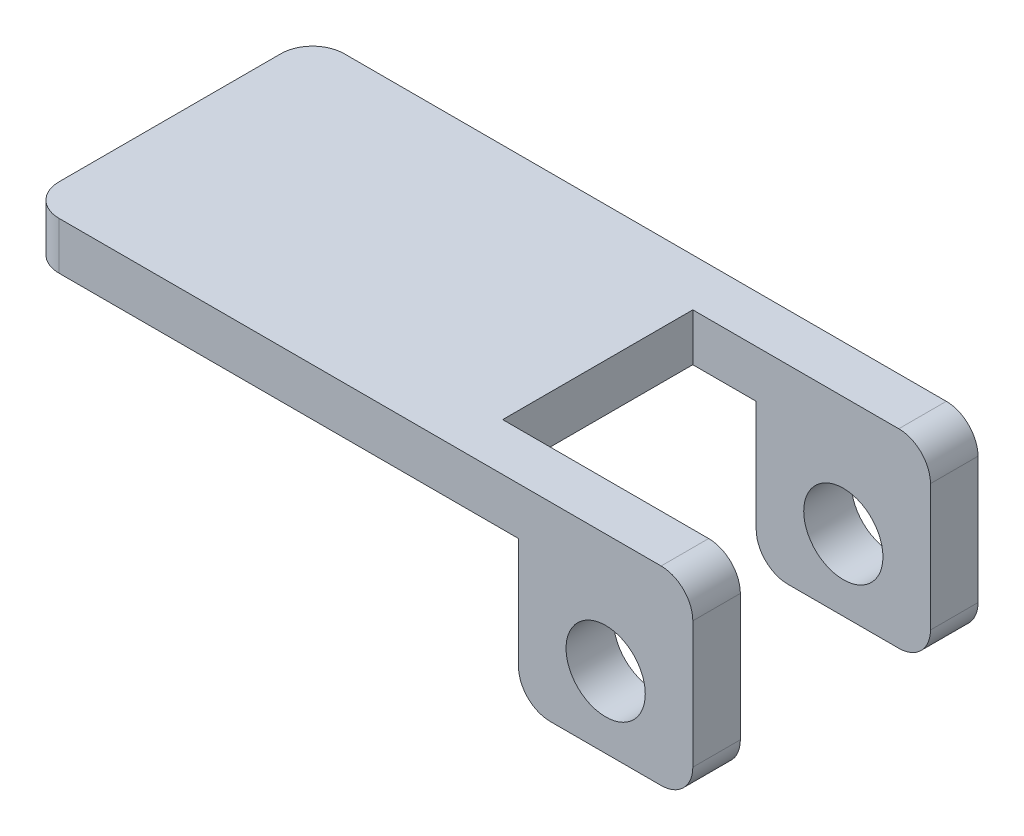
ISO-10303-21;
HEADER;
FILE_DESCRIPTION(('STEP AP214'),'2;1');
FILE_NAME('part.step','',(''),(''),'','','');
FILE_SCHEMA(('AUTOMOTIVE_DESIGN { 1 0 10303 214 1 1 1 1 }'));
ENDSEC;
DATA;
#1=APPLICATION_CONTEXT('core data for automotive mechanical design processes');
#2=APPLICATION_PROTOCOL_DEFINITION('international standard','automotive_design',2000,#1);
#3=PRODUCT_CONTEXT('',#1,'mechanical');
#4=PRODUCT('Part','Part','',(#3));
#5=PRODUCT_RELATED_PRODUCT_CATEGORY('part','',(#4));
#6=PRODUCT_DEFINITION_FORMATION('','',#4);
#7=PRODUCT_DEFINITION_CONTEXT('part definition',#1,'design');
#8=PRODUCT_DEFINITION('design','',#6,#7);
#9=PRODUCT_DEFINITION_SHAPE('','',#8);
#10=(LENGTH_UNIT() NAMED_UNIT(*) SI_UNIT(.MILLI.,.METRE.));
#11=(NAMED_UNIT(*) PLANE_ANGLE_UNIT() SI_UNIT($,.RADIAN.));
#12=(NAMED_UNIT(*) SI_UNIT($,.STERADIAN.) SOLID_ANGLE_UNIT());
#13=UNCERTAINTY_MEASURE_WITH_UNIT(LENGTH_MEASURE(1.E-05),#10,'distance_accuracy_value','');
#14=(GEOMETRIC_REPRESENTATION_CONTEXT(3) GLOBAL_UNCERTAINTY_ASSIGNED_CONTEXT((#13)) GLOBAL_UNIT_ASSIGNED_CONTEXT((#10,
#11,#12)) REPRESENTATION_CONTEXT('',''));
#15=CARTESIAN_POINT('',(0.,0.,0.));
#16=DIRECTION('',(0.,0.,1.));
#17=DIRECTION('',(1.,0.,0.));
#18=AXIS2_PLACEMENT_3D('',#15,#16,#17);
#19=CARTESIAN_POINT('',(42.,3.,0.));
#20=DIRECTION('',(-1.,0.,0.));
#21=DIRECTION('',(0.,0.,1.));
#22=AXIS2_PLACEMENT_3D('',#19,#20,#21);
#23=PLANE('',#22);
#24=DIRECTION('',(0.,1.,0.));
#25=VECTOR('',#24,1.);
#26=CARTESIAN_POINT('',(42.,-9.,-3.));
#27=LINE('',#26,#25);
#28=CARTESIAN_POINT('',(42.,-7.,-3.));
#29=VERTEX_POINT('',#28);
#30=CARTESIAN_POINT('',(42.,0.999999999999999,-3.));
#31=VERTEX_POINT('',#30);
#32=EDGE_CURVE('E245',#29,#31,#27,.T.);
#33=ORIENTED_EDGE('',*,*,#32,.T.);
#34=DIRECTION('',(0.,0.,-1.));
#35=VECTOR('',#34,1.);
#36=CARTESIAN_POINT('',(42.,1.,0.));
#37=LINE('',#36,#35);
#38=CARTESIAN_POINT('',(42.,1.,0.));
#39=VERTEX_POINT('',#38);
#40=EDGE_CURVE('E328',#31,#39,#37,.F.);
#41=ORIENTED_EDGE('',*,*,#40,.T.);
#42=DIRECTION('',(0.,-1.,0.));
#43=VECTOR('',#42,1.);
#44=CARTESIAN_POINT('',(42.,3.,0.));
#45=LINE('',#44,#43);
#46=CARTESIAN_POINT('',(42.,-7.,0.));
#47=VERTEX_POINT('',#46);
#48=EDGE_CURVE('E274',#39,#47,#45,.T.);
#49=ORIENTED_EDGE('',*,*,#48,.T.);
#50=DIRECTION('',(0.,0.,1.));
#51=VECTOR('',#50,1.);
#52=CARTESIAN_POINT('',(42.,-7.,0.));
#53=LINE('',#52,#51);
#54=EDGE_CURVE('E326',#47,#29,#53,.F.);
#55=ORIENTED_EDGE('',*,*,#54,.T.);
#56=EDGE_LOOP('',(#33,#41,#49,#55));
#57=FACE_BOUND('',#56,.T.);
#58=ADVANCED_FACE('F39',(#57),#23,.F.);
#59=CARTESIAN_POINT('',(0.,0.,0.));
#60=DIRECTION('',(0.,-1.,0.));
#61=DIRECTION('',(0.,0.,-1.));
#62=AXIS2_PLACEMENT_3D('',#59,#60,#61);
#63=PLANE('',#62);
#64=DIRECTION('',(0.,0.,1.));
#65=VECTOR('',#64,1.);
#66=CARTESIAN_POINT('',(0.,0.,0.));
#67=LINE('',#66,#65);
#68=CARTESIAN_POINT('',(0.,0.,-16.));
#69=VERTEX_POINT('',#68);
#70=CARTESIAN_POINT('',(0.,0.,-2.));
#71=VERTEX_POINT('',#70);
#72=EDGE_CURVE('E254',#69,#71,#67,.T.);
#73=ORIENTED_EDGE('',*,*,#72,.F.);
#74=CARTESIAN_POINT('',(2.,0.,-16.));
#75=DIRECTION('',(0.,-1.,0.));
#76=DIRECTION('',(0.,0.,-1.));
#77=AXIS2_PLACEMENT_3D('',#74,#75,#76);
#78=CIRCLE('',#77,2.);
#79=CARTESIAN_POINT('',(2.,0.,-18.));
#80=VERTEX_POINT('',#79);
#81=EDGE_CURVE('E286',#69,#80,#78,.T.);
#82=ORIENTED_EDGE('',*,*,#81,.T.);
#83=DIRECTION('',(-1.,0.,0.));
#84=VECTOR('',#83,1.);
#85=CARTESIAN_POINT('',(0.,0.,-18.));
#86=LINE('',#85,#84);
#87=CARTESIAN_POINT('',(31.,0.,-18.));
#88=VERTEX_POINT('',#87);
#89=EDGE_CURVE('E259',#88,#80,#86,.T.);
#90=ORIENTED_EDGE('',*,*,#89,.F.);
#91=DIRECTION('',(0.,0.,-1.));
#92=VECTOR('',#91,1.);
#93=CARTESIAN_POINT('',(31.,0.,-18.));
#94=LINE('',#93,#92);
#95=CARTESIAN_POINT('',(31.,0.,-15.));
#96=VERTEX_POINT('',#95);
#97=EDGE_CURVE('E205',#96,#88,#94,.T.);
#98=ORIENTED_EDGE('',*,*,#97,.F.);
#99=DIRECTION('',(-1.,0.,0.));
#100=VECTOR('',#99,1.);
#101=CARTESIAN_POINT('',(42.,0.,-15.));
#102=LINE('',#101,#100);
#103=CARTESIAN_POINT('',(27.,0.,-15.));
#104=VERTEX_POINT('',#103);
#105=EDGE_CURVE('E184',#96,#104,#102,.T.);
#106=ORIENTED_EDGE('',*,*,#105,.T.);
#107=DIRECTION('',(0.,0.,1.));
#108=VECTOR('',#107,1.);
#109=CARTESIAN_POINT('',(27.,0.,-15.));
#110=LINE('',#109,#108);
#111=CARTESIAN_POINT('',(27.,0.,-3.));
#112=VERTEX_POINT('',#111);
#113=EDGE_CURVE('E195',#104,#112,#110,.T.);
#114=ORIENTED_EDGE('',*,*,#113,.T.);
#115=DIRECTION('',(1.,0.,0.));
#116=VECTOR('',#115,1.);
#117=CARTESIAN_POINT('',(42.,0.,-3.));
#118=LINE('',#117,#116);
#119=CARTESIAN_POINT('',(31.,0.,-3.));
#120=VERTEX_POINT('',#119);
#121=EDGE_CURVE('E192',#112,#120,#118,.T.);
#122=ORIENTED_EDGE('',*,*,#121,.T.);
#123=DIRECTION('',(0.,0.,-1.));
#124=VECTOR('',#123,1.);
#125=CARTESIAN_POINT('',(31.,0.,0.));
#126=LINE('',#125,#124);
#127=CARTESIAN_POINT('',(31.,0.,0.));
#128=VERTEX_POINT('',#127);
#129=EDGE_CURVE('E239',#128,#120,#126,.T.);
#130=ORIENTED_EDGE('',*,*,#129,.F.);
#131=DIRECTION('',(1.,0.,0.));
#132=VECTOR('',#131,1.);
#133=CARTESIAN_POINT('',(0.,0.,0.));
#134=LINE('',#133,#132);
#135=CARTESIAN_POINT('',(2.,0.,0.));
#136=VERTEX_POINT('',#135);
#137=EDGE_CURVE('E267',#136,#128,#134,.T.);
#138=ORIENTED_EDGE('',*,*,#137,.F.);
#139=CARTESIAN_POINT('',(2.,0.,-2.));
#140=DIRECTION('',(0.,-1.,0.));
#141=DIRECTION('',(0.,0.,-1.));
#142=AXIS2_PLACEMENT_3D('',#139,#140,#141);
#143=CIRCLE('',#142,2.);
#144=EDGE_CURVE('E284',#136,#71,#143,.T.);
#145=ORIENTED_EDGE('',*,*,#144,.T.);
#146=EDGE_LOOP('',(#73,#82,#90,#98,#106,#114,#122,#130,#138,#145));
#147=FACE_BOUND('',#146,.T.);
#148=ADVANCED_FACE('F202',(#147),#63,.T.);
#149=CARTESIAN_POINT('',(0.,3.,0.));
#150=DIRECTION('',(1.,0.,0.));
#151=DIRECTION('',(0.,0.,-1.));
#152=AXIS2_PLACEMENT_3D('',#149,#150,#151);
#153=PLANE('',#152);
#154=DIRECTION('',(0.,0.,1.));
#155=VECTOR('',#154,1.);
#156=CARTESIAN_POINT('',(0.,3.,0.));
#157=LINE('',#156,#155);
#158=CARTESIAN_POINT('',(0.,3.,-16.));
#159=VERTEX_POINT('',#158);
#160=CARTESIAN_POINT('',(0.,3.,-2.));
#161=VERTEX_POINT('',#160);
#162=EDGE_CURVE('E255',#159,#161,#157,.T.);
#163=ORIENTED_EDGE('',*,*,#162,.F.);
#164=DIRECTION('',(0.,-1.,0.));
#165=VECTOR('',#164,1.);
#166=CARTESIAN_POINT('',(0.,3.,-16.));
#167=LINE('',#166,#165);
#168=EDGE_CURVE('E281',#159,#69,#167,.T.);
#169=ORIENTED_EDGE('',*,*,#168,.T.);
#170=ORIENTED_EDGE('',*,*,#72,.T.);
#171=DIRECTION('',(0.,-1.,0.));
#172=VECTOR('',#171,1.);
#173=CARTESIAN_POINT('',(0.,3.,-2.));
#174=LINE('',#173,#172);
#175=EDGE_CURVE('E277',#71,#161,#174,.F.);
#176=ORIENTED_EDGE('',*,*,#175,.T.);
#177=EDGE_LOOP('',(#163,#169,#170,#176));
#178=FACE_BOUND('',#177,.T.);
#179=ADVANCED_FACE('F394',(#178),#153,.F.);
#180=CARTESIAN_POINT('',(0.,3.,0.));
#181=DIRECTION('',(0.,0.,-1.));
#182=DIRECTION('',(-1.,0.,0.));
#183=AXIS2_PLACEMENT_3D('',#180,#181,#182);
#184=PLANE('',#183);
#185=CARTESIAN_POINT('',(36.5,-4.5,0.));
#186=DIRECTION('',(0.,0.,1.));
#187=DIRECTION('',(1.,0.,0.));
#188=AXIS2_PLACEMENT_3D('',#185,#186,#187);
#189=CIRCLE('',#188,2.5);
#190=CARTESIAN_POINT('',(39.,-4.5,0.));
#191=VERTEX_POINT('',#190);
#192=EDGE_CURVE('E215',#191,#191,#189,.T.);
#193=ORIENTED_EDGE('',*,*,#192,.F.);
#194=EDGE_LOOP('',(#193));
#195=FACE_BOUND('',#194,.T.);
#196=ORIENTED_EDGE('',*,*,#48,.F.);
#197=CARTESIAN_POINT('',(40.,1.,0.));
#198=DIRECTION('',(0.,0.,-1.));
#199=DIRECTION('',(-1.,0.,0.));
#200=AXIS2_PLACEMENT_3D('',#197,#198,#199);
#201=CIRCLE('',#200,2.);
#202=CARTESIAN_POINT('',(40.,3.,0.));
#203=VERTEX_POINT('',#202);
#204=EDGE_CURVE('E332',#39,#203,#201,.F.);
#205=ORIENTED_EDGE('',*,*,#204,.T.);
#206=DIRECTION('',(1.,0.,0.));
#207=VECTOR('',#206,1.);
#208=CARTESIAN_POINT('',(0.,3.,0.));
#209=LINE('',#208,#207);
#210=CARTESIAN_POINT('',(2.,3.,0.));
#211=VERTEX_POINT('',#210);
#212=EDGE_CURVE('E258',#211,#203,#209,.T.);
#213=ORIENTED_EDGE('',*,*,#212,.F.);
#214=DIRECTION('',(0.,-1.,0.));
#215=VECTOR('',#214,1.);
#216=CARTESIAN_POINT('',(2.,3.,0.));
#217=LINE('',#216,#215);
#218=EDGE_CURVE('E295',#211,#136,#217,.T.);
#219=ORIENTED_EDGE('',*,*,#218,.T.);
#220=ORIENTED_EDGE('',*,*,#137,.T.);
#221=DIRECTION('',(0.,1.,0.));
#222=VECTOR('',#221,1.);
#223=CARTESIAN_POINT('',(31.,-9.,0.));
#224=LINE('',#223,#222);
#225=CARTESIAN_POINT('',(31.,-7.,0.));
#226=VERTEX_POINT('',#225);
#227=EDGE_CURVE('E252',#226,#128,#224,.T.);
#228=ORIENTED_EDGE('',*,*,#227,.F.);
#229=CARTESIAN_POINT('',(33.,-7.,0.));
#230=DIRECTION('',(0.,0.,-1.));
#231=DIRECTION('',(-1.,0.,0.));
#232=AXIS2_PLACEMENT_3D('',#229,#230,#231);
#233=CIRCLE('',#232,2.);
#234=CARTESIAN_POINT('',(33.,-9.,0.));
#235=VERTEX_POINT('',#234);
#236=EDGE_CURVE('E54',#226,#235,#233,.F.);
#237=ORIENTED_EDGE('',*,*,#236,.T.);
#238=DIRECTION('',(-1.,0.,0.));
#239=VECTOR('',#238,1.);
#240=CARTESIAN_POINT('',(42.,-9.,0.));
#241=LINE('',#240,#239);
#242=CARTESIAN_POINT('',(40.,-9.,0.));
#243=VERTEX_POINT('',#242);
#244=EDGE_CURVE('E240',#243,#235,#241,.T.);
#245=ORIENTED_EDGE('',*,*,#244,.F.);
#246=CARTESIAN_POINT('',(40.,-7.,0.));
#247=DIRECTION('',(0.,0.,-1.));
#248=DIRECTION('',(-1.,0.,0.));
#249=AXIS2_PLACEMENT_3D('',#246,#247,#248);
#250=CIRCLE('',#249,2.);
#251=EDGE_CURVE('E62',#243,#47,#250,.F.);
#252=ORIENTED_EDGE('',*,*,#251,.T.);
#253=EDGE_LOOP('',(#196,#205,#213,#219,#220,#228,#237,#245,#252));
#254=FACE_BOUND('',#253,.T.);
#255=ADVANCED_FACE('F387',(#195,#254),#184,.F.);
#256=DIRECTION('',(0.,-1.,0.));
#257=VECTOR('',#256,1.);
#258=CARTESIAN_POINT('',(42.,3.,-18.));
#259=LINE('',#258,#257);
#260=CARTESIAN_POINT('',(42.,1.,-18.));
#261=VERTEX_POINT('',#260);
#262=CARTESIAN_POINT('',(42.,-7.,-18.));
#263=VERTEX_POINT('',#262);
#264=EDGE_CURVE('E264',#261,#263,#259,.T.);
#265=ORIENTED_EDGE('',*,*,#264,.F.);
#266=DIRECTION('',(0.,0.,-1.));
#267=VECTOR('',#266,1.);
#268=CARTESIAN_POINT('',(42.,1.,0.));
#269=LINE('',#268,#267);
#270=CARTESIAN_POINT('',(42.,0.999999999999999,-15.));
#271=VERTEX_POINT('',#270);
#272=EDGE_CURVE('E312',#261,#271,#269,.F.);
#273=ORIENTED_EDGE('',*,*,#272,.T.);
#274=DIRECTION('',(0.,1.,0.));
#275=VECTOR('',#274,1.);
#276=CARTESIAN_POINT('',(42.,-9.,-15.));
#277=LINE('',#276,#275);
#278=CARTESIAN_POINT('',(42.,-7.,-15.));
#279=VERTEX_POINT('',#278);
#280=EDGE_CURVE('E237',#279,#271,#277,.T.);
#281=ORIENTED_EDGE('',*,*,#280,.F.);
#282=DIRECTION('',(0.,0.,1.));
#283=VECTOR('',#282,1.);
#284=CARTESIAN_POINT('',(42.,-7.,-18.));
#285=LINE('',#284,#283);
#286=EDGE_CURVE('E310',#279,#263,#285,.F.);
#287=ORIENTED_EDGE('',*,*,#286,.T.);
#288=EDGE_LOOP('',(#265,#273,#281,#287));
#289=FACE_BOUND('',#288,.T.);
#290=ADVANCED_FACE('F368',(#289),#23,.F.);
#291=CARTESIAN_POINT('',(0.,3.,-18.));
#292=DIRECTION('',(0.,0.,1.));
#293=DIRECTION('',(1.,0.,0.));
#294=AXIS2_PLACEMENT_3D('',#291,#292,#293);
#295=PLANE('',#294);
#296=CARTESIAN_POINT('',(36.5,-4.5,-18.));
#297=DIRECTION('',(0.,0.,1.));
#298=DIRECTION('',(1.,0.,0.));
#299=AXIS2_PLACEMENT_3D('',#296,#297,#298);
#300=CIRCLE('',#299,2.5);
#301=CARTESIAN_POINT('',(39.,-4.5,-18.));
#302=VERTEX_POINT('',#301);
#303=EDGE_CURVE('E217',#302,#302,#300,.T.);
#304=ORIENTED_EDGE('',*,*,#303,.T.);
#305=EDGE_LOOP('',(#304));
#306=FACE_BOUND('',#305,.T.);
#307=DIRECTION('',(-1.,0.,0.));
#308=VECTOR('',#307,1.);
#309=CARTESIAN_POINT('',(0.,3.,-18.));
#310=LINE('',#309,#308);
#311=CARTESIAN_POINT('',(40.,3.,-18.));
#312=VERTEX_POINT('',#311);
#313=CARTESIAN_POINT('',(2.,3.,-18.));
#314=VERTEX_POINT('',#313);
#315=EDGE_CURVE('E262',#312,#314,#310,.T.);
#316=ORIENTED_EDGE('',*,*,#315,.F.);
#317=CARTESIAN_POINT('',(40.,1.,-18.));
#318=DIRECTION('',(0.,0.,1.));
#319=DIRECTION('',(1.,0.,0.));
#320=AXIS2_PLACEMENT_3D('',#317,#318,#319);
#321=CIRCLE('',#320,2.);
#322=EDGE_CURVE('E308',#312,#261,#321,.F.);
#323=ORIENTED_EDGE('',*,*,#322,.T.);
#324=ORIENTED_EDGE('',*,*,#264,.T.);
#325=CARTESIAN_POINT('',(40.,-7.,-18.));
#326=DIRECTION('',(0.,0.,1.));
#327=DIRECTION('',(1.,0.,0.));
#328=AXIS2_PLACEMENT_3D('',#325,#326,#327);
#329=CIRCLE('',#328,2.);
#330=CARTESIAN_POINT('',(40.,-9.,-18.));
#331=VERTEX_POINT('',#330);
#332=EDGE_CURVE('E306',#263,#331,#329,.F.);
#333=ORIENTED_EDGE('',*,*,#332,.T.);
#334=DIRECTION('',(1.,0.,0.));
#335=VECTOR('',#334,1.);
#336=CARTESIAN_POINT('',(42.,-9.,-18.));
#337=LINE('',#336,#335);
#338=CARTESIAN_POINT('',(33.,-9.,-18.));
#339=VERTEX_POINT('',#338);
#340=EDGE_CURVE('E229',#339,#331,#337,.T.);
#341=ORIENTED_EDGE('',*,*,#340,.F.);
#342=CARTESIAN_POINT('',(33.,-7.,-18.));
#343=DIRECTION('',(0.,0.,1.));
#344=DIRECTION('',(1.,0.,0.));
#345=AXIS2_PLACEMENT_3D('',#342,#343,#344);
#346=CIRCLE('',#345,2.);
#347=CARTESIAN_POINT('',(31.,-7.,-18.));
#348=VERTEX_POINT('',#347);
#349=EDGE_CURVE('E304',#339,#348,#346,.F.);
#350=ORIENTED_EDGE('',*,*,#349,.T.);
#351=DIRECTION('',(0.,1.,0.));
#352=VECTOR('',#351,1.);
#353=CARTESIAN_POINT('',(31.,-9.,-18.));
#354=LINE('',#353,#352);
#355=EDGE_CURVE('E232',#348,#88,#354,.T.);
#356=ORIENTED_EDGE('',*,*,#355,.T.);
#357=ORIENTED_EDGE('',*,*,#89,.T.);
#358=DIRECTION('',(0.,-1.,0.));
#359=VECTOR('',#358,1.);
#360=CARTESIAN_POINT('',(2.,3.,-18.));
#361=LINE('',#360,#359);
#362=EDGE_CURVE('E288',#80,#314,#361,.F.);
#363=ORIENTED_EDGE('',*,*,#362,.T.);
#364=EDGE_LOOP('',(#316,#323,#324,#333,#341,#350,#356,#357,#363));
#365=FACE_BOUND('',#364,.T.);
#366=ADVANCED_FACE('F359',(#306,#365),#295,.F.);
#367=CARTESIAN_POINT('',(0.,3.,0.));
#368=DIRECTION('',(0.,-1.,0.));
#369=DIRECTION('',(0.,0.,-1.));
#370=AXIS2_PLACEMENT_3D('',#367,#368,#369);
#371=PLANE('',#370);
#372=DIRECTION('',(-1.,0.,0.));
#373=VECTOR('',#372,1.);
#374=CARTESIAN_POINT('',(42.,3.,-15.));
#375=LINE('',#374,#373);
#376=CARTESIAN_POINT('',(40.,3.,-15.));
#377=VERTEX_POINT('',#376);
#378=CARTESIAN_POINT('',(27.,3.,-15.));
#379=VERTEX_POINT('',#378);
#380=EDGE_CURVE('E187',#377,#379,#375,.T.);
#381=ORIENTED_EDGE('',*,*,#380,.F.);
#382=DIRECTION('',(0.,0.,-1.));
#383=VECTOR('',#382,1.);
#384=CARTESIAN_POINT('',(40.,3.,0.));
#385=LINE('',#384,#383);
#386=EDGE_CURVE('E301',#377,#312,#385,.T.);
#387=ORIENTED_EDGE('',*,*,#386,.T.);
#388=ORIENTED_EDGE('',*,*,#315,.T.);
#389=CARTESIAN_POINT('',(2.,3.,-16.));
#390=DIRECTION('',(0.,-1.,0.));
#391=DIRECTION('',(0.,0.,-1.));
#392=AXIS2_PLACEMENT_3D('',#389,#390,#391);
#393=CIRCLE('',#392,2.);
#394=EDGE_CURVE('E293',#314,#159,#393,.F.);
#395=ORIENTED_EDGE('',*,*,#394,.T.);
#396=ORIENTED_EDGE('',*,*,#162,.T.);
#397=CARTESIAN_POINT('',(2.,3.,-2.));
#398=DIRECTION('',(0.,-1.,0.));
#399=DIRECTION('',(0.,0.,-1.));
#400=AXIS2_PLACEMENT_3D('',#397,#398,#399);
#401=CIRCLE('',#400,2.);
#402=EDGE_CURVE('E291',#161,#211,#401,.F.);
#403=ORIENTED_EDGE('',*,*,#402,.T.);
#404=ORIENTED_EDGE('',*,*,#212,.T.);
#405=DIRECTION('',(0.,0.,-1.));
#406=VECTOR('',#405,1.);
#407=CARTESIAN_POINT('',(40.,3.,0.));
#408=LINE('',#407,#406);
#409=CARTESIAN_POINT('',(40.,3.,-3.));
#410=VERTEX_POINT('',#409);
#411=EDGE_CURVE('E298',#203,#410,#408,.T.);
#412=ORIENTED_EDGE('',*,*,#411,.T.);
#413=DIRECTION('',(1.,0.,0.));
#414=VECTOR('',#413,1.);
#415=CARTESIAN_POINT('',(42.,3.,-3.));
#416=LINE('',#415,#414);
#417=CARTESIAN_POINT('',(27.,3.,-3.));
#418=VERTEX_POINT('',#417);
#419=EDGE_CURVE('E206',#418,#410,#416,.T.);
#420=ORIENTED_EDGE('',*,*,#419,.F.);
#421=DIRECTION('',(0.,0.,1.));
#422=VECTOR('',#421,1.);
#423=CARTESIAN_POINT('',(27.,3.,-15.));
#424=LINE('',#423,#422);
#425=EDGE_CURVE('E209',#379,#418,#424,.T.);
#426=ORIENTED_EDGE('',*,*,#425,.F.);
#427=EDGE_LOOP('',(#381,#387,#388,#395,#396,#403,#404,#412,#420,#426));
#428=FACE_BOUND('',#427,.T.);
#429=ADVANCED_FACE('F374',(#428),#371,.F.);
#430=CARTESIAN_POINT('',(31.,-9.,0.));
#431=DIRECTION('',(1.,0.,0.));
#432=DIRECTION('',(0.,0.,-1.));
#433=AXIS2_PLACEMENT_3D('',#430,#431,#432);
#434=PLANE('',#433);
#435=DIRECTION('',(0.,1.,0.));
#436=VECTOR('',#435,1.);
#437=CARTESIAN_POINT('',(31.,-9.,-3.));
#438=LINE('',#437,#436);
#439=CARTESIAN_POINT('',(31.,-7.,-3.));
#440=VERTEX_POINT('',#439);
#441=EDGE_CURVE('E250',#440,#120,#438,.T.);
#442=ORIENTED_EDGE('',*,*,#441,.F.);
#443=DIRECTION('',(0.,0.,-1.));
#444=VECTOR('',#443,1.);
#445=CARTESIAN_POINT('',(31.,-7.,0.));
#446=LINE('',#445,#444);
#447=EDGE_CURVE('E11',#440,#226,#446,.F.);
#448=ORIENTED_EDGE('',*,*,#447,.T.);
#449=ORIENTED_EDGE('',*,*,#227,.T.);
#450=ORIENTED_EDGE('',*,*,#129,.T.);
#451=EDGE_LOOP('',(#442,#448,#449,#450));
#452=FACE_BOUND('',#451,.T.);
#453=ADVANCED_FACE('F384',(#452),#434,.F.);
#454=CARTESIAN_POINT('',(42.,-9.,-3.));
#455=DIRECTION('',(0.,0.,1.));
#456=DIRECTION('',(1.,0.,0.));
#457=AXIS2_PLACEMENT_3D('',#454,#455,#456);
#458=PLANE('',#457);
#459=CARTESIAN_POINT('',(36.5,-4.5,-3.));
#460=DIRECTION('',(0.,0.,1.));
#461=DIRECTION('',(1.,0.,0.));
#462=AXIS2_PLACEMENT_3D('',#459,#460,#461);
#463=CIRCLE('',#462,2.5);
#464=CARTESIAN_POINT('',(39.,-4.5,-3.));
#465=VERTEX_POINT('',#464);
#466=EDGE_CURVE('E223',#465,#465,#463,.T.);
#467=ORIENTED_EDGE('',*,*,#466,.T.);
#468=EDGE_LOOP('',(#467));
#469=FACE_BOUND('',#468,.T.);
#470=ORIENTED_EDGE('',*,*,#419,.T.);
#471=CARTESIAN_POINT('',(40.,1.,-3.));
#472=DIRECTION('',(0.,0.,1.));
#473=DIRECTION('',(1.,0.,0.));
#474=AXIS2_PLACEMENT_3D('',#471,#472,#473);
#475=CIRCLE('',#474,2.);
#476=EDGE_CURVE('E324',#410,#31,#475,.F.);
#477=ORIENTED_EDGE('',*,*,#476,.T.);
#478=ORIENTED_EDGE('',*,*,#32,.F.);
#479=CARTESIAN_POINT('',(40.,-7.,-3.));
#480=DIRECTION('',(0.,0.,1.));
#481=DIRECTION('',(1.,0.,0.));
#482=AXIS2_PLACEMENT_3D('',#479,#480,#481);
#483=CIRCLE('',#482,2.);
#484=CARTESIAN_POINT('',(40.,-9.,-3.));
#485=VERTEX_POINT('',#484);
#486=EDGE_CURVE('E322',#29,#485,#483,.F.);
#487=ORIENTED_EDGE('',*,*,#486,.T.);
#488=DIRECTION('',(1.,0.,0.));
#489=VECTOR('',#488,1.);
#490=CARTESIAN_POINT('',(42.,-9.,-3.));
#491=LINE('',#490,#489);
#492=CARTESIAN_POINT('',(33.,-9.,-3.));
#493=VERTEX_POINT('',#492);
#494=EDGE_CURVE('E242',#493,#485,#491,.T.);
#495=ORIENTED_EDGE('',*,*,#494,.F.);
#496=CARTESIAN_POINT('',(33.,-7.,-3.));
#497=DIRECTION('',(0.,0.,1.));
#498=DIRECTION('',(1.,0.,0.));
#499=AXIS2_PLACEMENT_3D('',#496,#497,#498);
#500=CIRCLE('',#499,2.);
#501=EDGE_CURVE('E320',#493,#440,#500,.F.);
#502=ORIENTED_EDGE('',*,*,#501,.T.);
#503=ORIENTED_EDGE('',*,*,#441,.T.);
#504=ORIENTED_EDGE('',*,*,#121,.F.);
#505=DIRECTION('',(0.,1.,0.));
#506=VECTOR('',#505,1.);
#507=CARTESIAN_POINT('',(27.,0.,-3.));
#508=LINE('',#507,#506);
#509=EDGE_CURVE('E191',#112,#418,#508,.T.);
#510=ORIENTED_EDGE('',*,*,#509,.T.);
#511=EDGE_LOOP('',(#470,#477,#478,#487,#495,#502,#503,#504,#510));
#512=FACE_BOUND('',#511,.T.);
#513=ADVANCED_FACE('F378',(#469,#512),#458,.F.);
#514=CARTESIAN_POINT('',(0.,-9.,0.));
#515=DIRECTION('',(0.,1.,0.));
#516=DIRECTION('',(0.,0.,1.));
#517=AXIS2_PLACEMENT_3D('',#514,#515,#516);
#518=PLANE('',#517);
#519=ORIENTED_EDGE('',*,*,#494,.T.);
#520=DIRECTION('',(0.,0.,1.));
#521=VECTOR('',#520,1.);
#522=CARTESIAN_POINT('',(40.,-9.,0.));
#523=LINE('',#522,#521);
#524=EDGE_CURVE('E343',#485,#243,#523,.T.);
#525=ORIENTED_EDGE('',*,*,#524,.T.);
#526=ORIENTED_EDGE('',*,*,#244,.T.);
#527=DIRECTION('',(0.,0.,-1.));
#528=VECTOR('',#527,1.);
#529=CARTESIAN_POINT('',(33.,-9.,0.));
#530=LINE('',#529,#528);
#531=EDGE_CURVE('E340',#235,#493,#530,.T.);
#532=ORIENTED_EDGE('',*,*,#531,.T.);
#533=EDGE_LOOP('',(#519,#525,#526,#532));
#534=FACE_BOUND('',#533,.T.);
#535=ADVANCED_FACE('F407',(#534),#518,.F.);
#536=CARTESIAN_POINT('',(42.,-9.,-15.));
#537=DIRECTION('',(0.,0.,-1.));
#538=DIRECTION('',(-1.,0.,0.));
#539=AXIS2_PLACEMENT_3D('',#536,#537,#538);
#540=PLANE('',#539);
#541=CARTESIAN_POINT('',(36.5,-4.5,-15.));
#542=DIRECTION('',(0.,0.,-1.));
#543=DIRECTION('',(-1.,0.,0.));
#544=AXIS2_PLACEMENT_3D('',#541,#542,#543);
#545=CIRCLE('',#544,2.5);
#546=CARTESIAN_POINT('',(34.,-4.5,-15.));
#547=VERTEX_POINT('',#546);
#548=EDGE_CURVE('E220',#547,#547,#545,.T.);
#549=ORIENTED_EDGE('',*,*,#548,.T.);
#550=EDGE_LOOP('',(#549));
#551=FACE_BOUND('',#550,.T.);
#552=ORIENTED_EDGE('',*,*,#280,.T.);
#553=CARTESIAN_POINT('',(40.,1.,-15.));
#554=DIRECTION('',(0.,0.,-1.));
#555=DIRECTION('',(-1.,0.,0.));
#556=AXIS2_PLACEMENT_3D('',#553,#554,#555);
#557=CIRCLE('',#556,2.);
#558=EDGE_CURVE('E318',#271,#377,#557,.F.);
#559=ORIENTED_EDGE('',*,*,#558,.T.);
#560=ORIENTED_EDGE('',*,*,#380,.T.);
#561=DIRECTION('',(0.,1.,0.));
#562=VECTOR('',#561,1.);
#563=CARTESIAN_POINT('',(27.,0.,-15.));
#564=LINE('',#563,#562);
#565=EDGE_CURVE('E178',#104,#379,#564,.T.);
#566=ORIENTED_EDGE('',*,*,#565,.F.);
#567=ORIENTED_EDGE('',*,*,#105,.F.);
#568=DIRECTION('',(0.,1.,0.));
#569=VECTOR('',#568,1.);
#570=CARTESIAN_POINT('',(31.,-9.,-15.));
#571=LINE('',#570,#569);
#572=CARTESIAN_POINT('',(31.,-7.,-15.));
#573=VERTEX_POINT('',#572);
#574=EDGE_CURVE('E235',#573,#96,#571,.T.);
#575=ORIENTED_EDGE('',*,*,#574,.F.);
#576=CARTESIAN_POINT('',(33.,-7.,-15.));
#577=DIRECTION('',(0.,0.,-1.));
#578=DIRECTION('',(-1.,0.,0.));
#579=AXIS2_PLACEMENT_3D('',#576,#577,#578);
#580=CIRCLE('',#579,2.);
#581=CARTESIAN_POINT('',(33.,-9.,-15.));
#582=VERTEX_POINT('',#581);
#583=EDGE_CURVE('E314',#573,#582,#580,.F.);
#584=ORIENTED_EDGE('',*,*,#583,.T.);
#585=DIRECTION('',(-1.,0.,0.));
#586=VECTOR('',#585,1.);
#587=CARTESIAN_POINT('',(42.,-9.,-15.));
#588=LINE('',#587,#586);
#589=CARTESIAN_POINT('',(40.,-9.,-15.));
#590=VERTEX_POINT('',#589);
#591=EDGE_CURVE('E226',#590,#582,#588,.T.);
#592=ORIENTED_EDGE('',*,*,#591,.F.);
#593=CARTESIAN_POINT('',(40.,-7.,-15.));
#594=DIRECTION('',(0.,0.,-1.));
#595=DIRECTION('',(-1.,0.,0.));
#596=AXIS2_PLACEMENT_3D('',#593,#594,#595);
#597=CIRCLE('',#596,2.);
#598=EDGE_CURVE('E316',#590,#279,#597,.F.);
#599=ORIENTED_EDGE('',*,*,#598,.T.);
#600=EDGE_LOOP('',(#552,#559,#560,#566,#567,#575,#584,#592,#599));
#601=FACE_BOUND('',#600,.T.);
#602=ADVANCED_FACE('F181',(#551,#601),#540,.F.);
#603=CARTESIAN_POINT('',(31.,-9.,-18.));
#604=DIRECTION('',(1.,0.,0.));
#605=DIRECTION('',(0.,0.,-1.));
#606=AXIS2_PLACEMENT_3D('',#603,#604,#605);
#607=PLANE('',#606);
#608=ORIENTED_EDGE('',*,*,#355,.F.);
#609=DIRECTION('',(0.,0.,-1.));
#610=VECTOR('',#609,1.);
#611=CARTESIAN_POINT('',(31.,-7.,-15.));
#612=LINE('',#611,#610);
#613=EDGE_CURVE('E47',#348,#573,#612,.F.);
#614=ORIENTED_EDGE('',*,*,#613,.T.);
#615=ORIENTED_EDGE('',*,*,#574,.T.);
#616=ORIENTED_EDGE('',*,*,#97,.T.);
#617=EDGE_LOOP('',(#608,#614,#615,#616));
#618=FACE_BOUND('',#617,.T.);
#619=ADVANCED_FACE('F347',(#618),#607,.F.);
#620=CARTESIAN_POINT('',(0.,-9.,0.));
#621=DIRECTION('',(0.,-1.,0.));
#622=DIRECTION('',(0.,0.,-1.));
#623=AXIS2_PLACEMENT_3D('',#620,#621,#622);
#624=PLANE('',#623);
#625=ORIENTED_EDGE('',*,*,#340,.T.);
#626=DIRECTION('',(0.,0.,1.));
#627=VECTOR('',#626,1.);
#628=CARTESIAN_POINT('',(40.,-9.,-15.));
#629=LINE('',#628,#627);
#630=EDGE_CURVE('E337',#331,#590,#629,.T.);
#631=ORIENTED_EDGE('',*,*,#630,.T.);
#632=ORIENTED_EDGE('',*,*,#591,.T.);
#633=DIRECTION('',(0.,0.,-1.));
#634=VECTOR('',#633,1.);
#635=CARTESIAN_POINT('',(33.,-9.,-18.));
#636=LINE('',#635,#634);
#637=EDGE_CURVE('E334',#582,#339,#636,.T.);
#638=ORIENTED_EDGE('',*,*,#637,.T.);
#639=EDGE_LOOP('',(#625,#631,#632,#638));
#640=FACE_BOUND('',#639,.T.);
#641=ADVANCED_FACE('F355',(#640),#624,.T.);
#642=CARTESIAN_POINT('',(36.5,-4.5,-18.));
#643=DIRECTION('',(0.,0.,1.));
#644=DIRECTION('',(1.,0.,0.));
#645=AXIS2_PLACEMENT_3D('',#642,#643,#644);
#646=CYLINDRICAL_SURFACE('',#645,2.5);
#647=ORIENTED_EDGE('',*,*,#303,.F.);
#648=EDGE_LOOP('',(#647));
#649=FACE_BOUND('',#648,.T.);
#650=ORIENTED_EDGE('',*,*,#548,.F.);
#651=EDGE_LOOP('',(#650));
#652=FACE_BOUND('',#651,.T.);
#653=ADVANCED_FACE('F583',(#649,#652),#646,.F.);
#654=ORIENTED_EDGE('',*,*,#192,.T.);
#655=EDGE_LOOP('',(#654));
#656=FACE_BOUND('',#655,.T.);
#657=ORIENTED_EDGE('',*,*,#466,.F.);
#658=EDGE_LOOP('',(#657));
#659=FACE_BOUND('',#658,.T.);
#660=ADVANCED_FACE('F498',(#656,#659),#646,.F.);
#661=CARTESIAN_POINT('',(27.,0.,-15.));
#662=DIRECTION('',(-1.,0.,0.));
#663=DIRECTION('',(0.,0.,1.));
#664=AXIS2_PLACEMENT_3D('',#661,#662,#663);
#665=PLANE('',#664);
#666=ORIENTED_EDGE('',*,*,#425,.T.);
#667=ORIENTED_EDGE('',*,*,#509,.F.);
#668=ORIENTED_EDGE('',*,*,#113,.F.);
#669=ORIENTED_EDGE('',*,*,#565,.T.);
#670=EDGE_LOOP('',(#666,#667,#668,#669));
#671=FACE_BOUND('',#670,.T.);
#672=ADVANCED_FACE('F196',(#671),#665,.F.);
#673=CARTESIAN_POINT('',(2.,3.,-16.));
#674=DIRECTION('',(0.,-1.,0.));
#675=DIRECTION('',(0.,0.,-1.));
#676=AXIS2_PLACEMENT_3D('',#673,#674,#675);
#677=CYLINDRICAL_SURFACE('',#676,2.);
#678=ORIENTED_EDGE('',*,*,#394,.F.);
#679=ORIENTED_EDGE('',*,*,#362,.F.);
#680=ORIENTED_EDGE('',*,*,#81,.F.);
#681=ORIENTED_EDGE('',*,*,#168,.F.);
#682=EDGE_LOOP('',(#678,#679,#680,#681));
#683=FACE_BOUND('',#682,.T.);
#684=ADVANCED_FACE('F435',(#683),#677,.T.);
#685=CARTESIAN_POINT('',(2.,3.,-2.));
#686=DIRECTION('',(0.,-1.,0.));
#687=DIRECTION('',(0.,0.,-1.));
#688=AXIS2_PLACEMENT_3D('',#685,#686,#687);
#689=CYLINDRICAL_SURFACE('',#688,2.);
#690=ORIENTED_EDGE('',*,*,#402,.F.);
#691=ORIENTED_EDGE('',*,*,#175,.F.);
#692=ORIENTED_EDGE('',*,*,#144,.F.);
#693=ORIENTED_EDGE('',*,*,#218,.F.);
#694=EDGE_LOOP('',(#690,#691,#692,#693));
#695=FACE_BOUND('',#694,.T.);
#696=ADVANCED_FACE('F397',(#695),#689,.T.);
#697=CARTESIAN_POINT('',(40.,1.,0.));
#698=DIRECTION('',(0.,0.,-1.));
#699=DIRECTION('',(-1.,0.,0.));
#700=AXIS2_PLACEMENT_3D('',#697,#698,#699);
#701=CYLINDRICAL_SURFACE('',#700,2.);
#702=ORIENTED_EDGE('',*,*,#558,.F.);
#703=ORIENTED_EDGE('',*,*,#272,.F.);
#704=ORIENTED_EDGE('',*,*,#322,.F.);
#705=ORIENTED_EDGE('',*,*,#386,.F.);
#706=EDGE_LOOP('',(#702,#703,#704,#705));
#707=FACE_BOUND('',#706,.T.);
#708=ADVANCED_FACE('F371',(#707),#701,.T.);
#709=CARTESIAN_POINT('',(40.,1.,0.));
#710=DIRECTION('',(0.,0.,-1.));
#711=DIRECTION('',(-1.,0.,0.));
#712=AXIS2_PLACEMENT_3D('',#709,#710,#711);
#713=CYLINDRICAL_SURFACE('',#712,2.);
#714=ORIENTED_EDGE('',*,*,#204,.F.);
#715=ORIENTED_EDGE('',*,*,#40,.F.);
#716=ORIENTED_EDGE('',*,*,#476,.F.);
#717=ORIENTED_EDGE('',*,*,#411,.F.);
#718=EDGE_LOOP('',(#714,#715,#716,#717));
#719=FACE_BOUND('',#718,.T.);
#720=ADVANCED_FACE('F401',(#719),#713,.T.);
#721=CARTESIAN_POINT('',(40.,-7.,0.));
#722=DIRECTION('',(0.,0.,-1.));
#723=DIRECTION('',(-1.,0.,0.));
#724=AXIS2_PLACEMENT_3D('',#721,#722,#723);
#725=CYLINDRICAL_SURFACE('',#724,2.);
#726=ORIENTED_EDGE('',*,*,#332,.F.);
#727=ORIENTED_EDGE('',*,*,#286,.F.);
#728=ORIENTED_EDGE('',*,*,#598,.F.);
#729=ORIENTED_EDGE('',*,*,#630,.F.);
#730=EDGE_LOOP('',(#726,#727,#728,#729));
#731=FACE_BOUND('',#730,.T.);
#732=ADVANCED_FACE('F364',(#731),#725,.T.);
#733=CARTESIAN_POINT('',(40.,-7.,0.));
#734=DIRECTION('',(0.,0.,1.));
#735=DIRECTION('',(1.,0.,0.));
#736=AXIS2_PLACEMENT_3D('',#733,#734,#735);
#737=CYLINDRICAL_SURFACE('',#736,2.);
#738=ORIENTED_EDGE('',*,*,#486,.F.);
#739=ORIENTED_EDGE('',*,*,#54,.F.);
#740=ORIENTED_EDGE('',*,*,#251,.F.);
#741=ORIENTED_EDGE('',*,*,#524,.F.);
#742=EDGE_LOOP('',(#738,#739,#740,#741));
#743=FACE_BOUND('',#742,.T.);
#744=ADVANCED_FACE('F405',(#743),#737,.T.);
#745=CARTESIAN_POINT('',(33.,-7.,0.));
#746=DIRECTION('',(0.,0.,1.));
#747=DIRECTION('',(1.,0.,0.));
#748=AXIS2_PLACEMENT_3D('',#745,#746,#747);
#749=CYLINDRICAL_SURFACE('',#748,2.);
#750=ORIENTED_EDGE('',*,*,#583,.F.);
#751=ORIENTED_EDGE('',*,*,#613,.F.);
#752=ORIENTED_EDGE('',*,*,#349,.F.);
#753=ORIENTED_EDGE('',*,*,#637,.F.);
#754=EDGE_LOOP('',(#750,#751,#752,#753));
#755=FACE_BOUND('',#754,.T.);
#756=ADVANCED_FACE('F352',(#755),#749,.T.);
#757=CARTESIAN_POINT('',(33.,-7.,0.));
#758=DIRECTION('',(0.,0.,-1.));
#759=DIRECTION('',(-1.,0.,0.));
#760=AXIS2_PLACEMENT_3D('',#757,#758,#759);
#761=CYLINDRICAL_SURFACE('',#760,2.);
#762=ORIENTED_EDGE('',*,*,#236,.F.);
#763=ORIENTED_EDGE('',*,*,#447,.F.);
#764=ORIENTED_EDGE('',*,*,#501,.F.);
#765=ORIENTED_EDGE('',*,*,#531,.F.);
#766=EDGE_LOOP('',(#762,#763,#764,#765));
#767=FACE_BOUND('',#766,.T.);
#768=ADVANCED_FACE('F41',(#767),#761,.T.);
#769=CLOSED_SHELL('',(#58,#148,#179,#255,#290,#366,#429,#453,#513,#535,#602,#619,#641,#653,#660,
#672,#684,#696,#708,#720,#732,#744,#756,#768));
#770=MANIFOLD_SOLID_BREP('B2',#769);
#771=ADVANCED_BREP_SHAPE_REPRESENTATION('',(#18,#770),#14);
#772=SHAPE_DEFINITION_REPRESENTATION(#9,#771);
ENDSEC;
END-ISO-10303-21;
